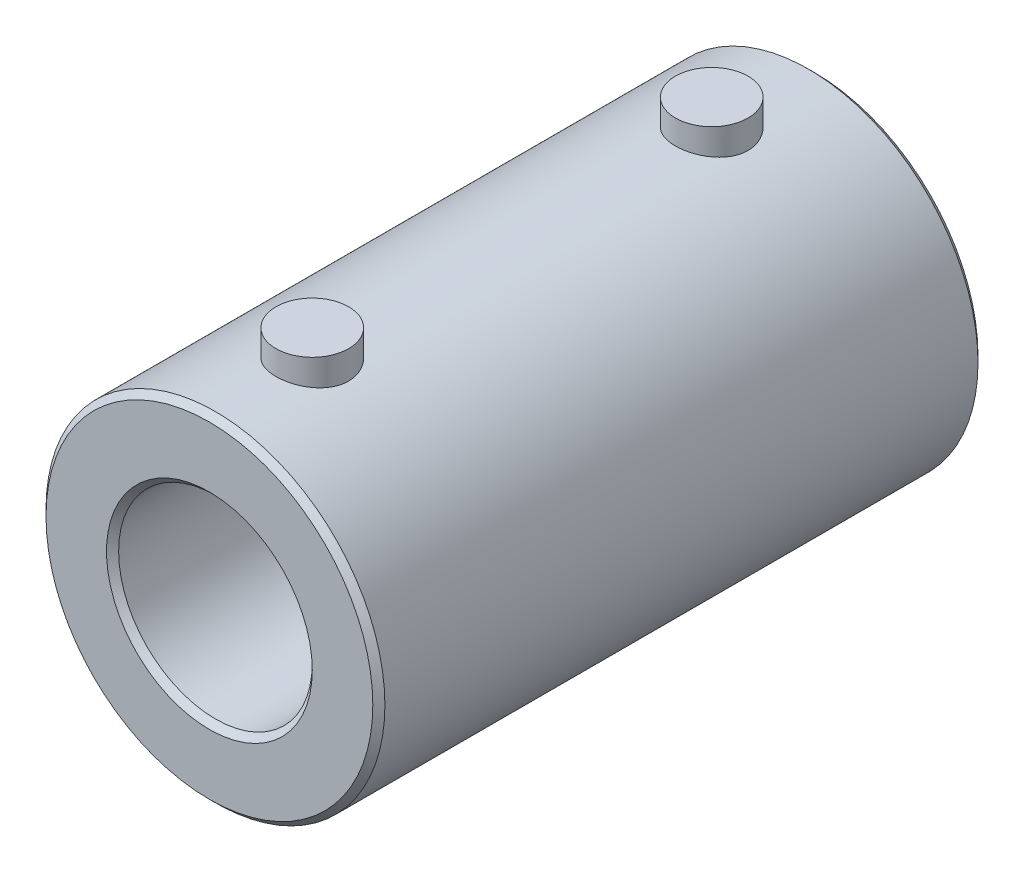
ISO-10303-21;
HEADER;
FILE_DESCRIPTION(('STEP AP214'),'2;1');
FILE_NAME('part.step','',(''),(''),'','','');
FILE_SCHEMA(('AUTOMOTIVE_DESIGN { 1 0 10303 214 1 1 1 1 }'));
ENDSEC;
DATA;
#1=APPLICATION_CONTEXT('core data for automotive mechanical design processes');
#2=APPLICATION_PROTOCOL_DEFINITION('international standard','automotive_design',2000,#1);
#3=PRODUCT_CONTEXT('',#1,'mechanical');
#4=PRODUCT('Part','Part','',(#3));
#5=PRODUCT_RELATED_PRODUCT_CATEGORY('part','',(#4));
#6=PRODUCT_DEFINITION_FORMATION('','',#4);
#7=PRODUCT_DEFINITION_CONTEXT('part definition',#1,'design');
#8=PRODUCT_DEFINITION('design','',#6,#7);
#9=PRODUCT_DEFINITION_SHAPE('','',#8);
#10=(LENGTH_UNIT() NAMED_UNIT(*) SI_UNIT(.MILLI.,.METRE.));
#11=(NAMED_UNIT(*) PLANE_ANGLE_UNIT() SI_UNIT($,.RADIAN.));
#12=(NAMED_UNIT(*) SI_UNIT($,.STERADIAN.) SOLID_ANGLE_UNIT());
#13=UNCERTAINTY_MEASURE_WITH_UNIT(LENGTH_MEASURE(1.E-05),#10,'distance_accuracy_value','');
#14=(GEOMETRIC_REPRESENTATION_CONTEXT(3) GLOBAL_UNCERTAINTY_ASSIGNED_CONTEXT((#13)) GLOBAL_UNIT_ASSIGNED_CONTEXT((#10,
#11,#12)) REPRESENTATION_CONTEXT('',''));
#15=CARTESIAN_POINT('',(0.,0.,0.));
#16=DIRECTION('',(0.,0.,1.));
#17=DIRECTION('',(1.,0.,0.));
#18=AXIS2_PLACEMENT_3D('',#15,#16,#17);
#19=CARTESIAN_POINT('',(0.,0.,25.));
#20=DIRECTION('',(0.,0.,-1.));
#21=DIRECTION('',(-1.,0.,0.));
#22=AXIS2_PLACEMENT_3D('',#19,#20,#21);
#23=CYLINDRICAL_SURFACE('',#22,7.);
#24=CARTESIAN_POINT('',(0.,0.,0.249999999999993));
#25=DIRECTION('',(0.,0.,1.));
#26=DIRECTION('',(1.,0.,0.));
#27=AXIS2_PLACEMENT_3D('',#24,#25,#26);
#28=CIRCLE('',#27,7.);
#29=CARTESIAN_POINT('',(7.,0.,0.249999999999993));
#30=VERTEX_POINT('',#29);
#31=EDGE_CURVE('E90',#30,#30,#28,.T.);
#32=ORIENTED_EDGE('',*,*,#31,.T.);
#33=EDGE_LOOP('',(#32));
#34=FACE_BOUND('',#33,.T.);
#35=CARTESIAN_POINT('',(0.,0.,24.75));
#36=DIRECTION('',(0.,0.,1.));
#37=DIRECTION('',(1.,0.,0.));
#38=AXIS2_PLACEMENT_3D('',#35,#36,#37);
#39=CIRCLE('',#38,7.);
#40=CARTESIAN_POINT('',(7.,0.,24.75));
#41=VERTEX_POINT('',#40);
#42=EDGE_CURVE('E94',#41,#41,#39,.F.);
#43=ORIENTED_EDGE('',*,*,#42,.T.);
#44=EDGE_LOOP('',(#43));
#45=FACE_BOUND('',#44,.T.);
#46=CARTESIAN_POINT('',(0.,7.,2.74999999999999));
#47=CARTESIAN_POINT('',(-0.0832358860906167,6.99999846043226,2.75000289957429));
#48=CARTESIAN_POINT('',(-0.166507195600275,6.9985002594971,2.75695160838785));
#49=CARTESIAN_POINT('',(-0.330687344293327,6.99266829827728,2.78453565685358));
#50=CARTESIAN_POINT('',(-0.41159440357119,6.98833245637099,2.80518104419493));
#51=CARTESIAN_POINT('',(-0.568649323817737,6.97730831788827,2.85948436460803));
#52=CARTESIAN_POINT('',(-0.644801963446556,6.97062242967171,2.89312897938131));
#53=CARTESIAN_POINT('',(-0.790378177960787,6.95562106817971,2.97243408617126));
#54=CARTESIAN_POINT('',(-0.859801981747369,6.94730565036661,3.01809416924993));
#55=CARTESIAN_POINT('',(-0.991024790535229,6.92981369246311,3.1208802996735));
#56=CARTESIAN_POINT('',(-1.05270503419445,6.92062683143259,3.17815622189852));
#57=CARTESIAN_POINT('',(-1.16566042389435,6.90250069814144,3.30222631568519));
#58=CARTESIAN_POINT('',(-1.21693467150908,6.8935614473163,3.36902130825125));
#59=CARTESIAN_POINT('',(-1.30814204379809,6.87684116047225,3.51110575286043));
#60=CARTESIAN_POINT('',(-1.34794958335009,6.8690733634436,3.5864775177562));
#61=CARTESIAN_POINT('',(-1.41428823691148,6.85572325558537,3.74303445376683));
#62=CARTESIAN_POINT('',(-1.44082087001716,6.85014069470711,3.82421895849257));
#63=CARTESIAN_POINT('',(-1.47946574422454,6.84189808926311,3.98881108658807));
#64=CARTESIAN_POINT('',(-1.49178779748342,6.83919556896486,4.07216727566386));
#65=CARTESIAN_POINT('',(-1.50231395206577,6.83689139845106,4.23980423250699));
#66=CARTESIAN_POINT('',(-1.50051971664629,6.83728938291729,4.32408489017994));
#67=CARTESIAN_POINT('',(-1.48303326340861,6.84110276603832,4.48962468793378));
#68=CARTESIAN_POINT('',(-1.46758398649408,6.84446541682162,4.57091088910015));
#69=CARTESIAN_POINT('',(-1.42361054298677,6.85374593375788,4.72971024028933));
#70=CARTESIAN_POINT('',(-1.39508566936466,6.85966393808402,4.80722318603231));
#71=CARTESIAN_POINT('',(-1.32554551075991,6.87344080755724,4.95696287287333));
#72=CARTESIAN_POINT('',(-1.2844361097283,6.88131420983365,5.02914451271254));
#73=CARTESIAN_POINT('',(-1.19096007283993,6.89810572501288,5.16567516495795));
#74=CARTESIAN_POINT('',(-1.13859196103562,6.90702397481896,5.23002314868619));
#75=CARTESIAN_POINT('',(-1.0227954275532,6.92512718393878,5.35045935567339));
#76=CARTESIAN_POINT('',(-0.959160233964409,6.93431383972178,5.40634870658473));
#77=CARTESIAN_POINT('',(-0.823317306269096,6.95175017497059,5.50669373368965));
#78=CARTESIAN_POINT('',(-0.751109428775399,6.95999983875972,5.55114921860038));
#79=CARTESIAN_POINT('',(-0.599933462049959,6.97465778534003,5.62741067990692));
#80=CARTESIAN_POINT('',(-0.520952258863482,6.98106238643354,5.65919141257797));
#81=CARTESIAN_POINT('',(-0.358603146685705,6.99128109245334,5.70897564832108));
#82=CARTESIAN_POINT('',(-0.275235851133668,6.99509555860384,5.72698107256331));
#83=CARTESIAN_POINT('',(-0.108187670836628,6.99965306347808,5.74841621414342));
#84=CARTESIAN_POINT('',(-0.0245431772716138,7.00045336521066,5.75211771288177));
#85=CARTESIAN_POINT('',(0.142168973650405,6.99905248935969,5.74557542887483));
#86=CARTESIAN_POINT('',(0.225236668127256,6.99685150675698,5.73533255203705));
#87=CARTESIAN_POINT('',(0.387542537982806,6.98973143045266,5.70141775633829));
#88=CARTESIAN_POINT('',(0.466811712908478,6.9848410504546,5.67788763052746));
#89=CARTESIAN_POINT('',(0.620278450473418,6.9728892442151,5.61822305700517));
#90=CARTESIAN_POINT('',(0.69447559258774,6.96582763822237,5.58208756568834));
#91=CARTESIAN_POINT('',(0.836821397964754,6.950175043904,5.49766645693967));
#92=CARTESIAN_POINT('',(0.904872575111141,6.94156431354275,5.44922020509026));
#93=CARTESIAN_POINT('',(1.0319769255236,6.92381033034847,5.34176517511125));
#94=CARTESIAN_POINT('',(1.091028978692,6.91466701142097,5.28275508411255));
#95=CARTESIAN_POINT('',(1.19952711057989,6.89668172706324,5.15460262981285));
#96=CARTESIAN_POINT('',(1.24878537255157,6.88784792221285,5.08529990077789));
#97=CARTESIAN_POINT('',(1.3349641538604,6.87166654559681,4.939245403522));
#98=CARTESIAN_POINT('',(1.37188519913706,6.86431891048055,4.8624939530225));
#99=CARTESIAN_POINT('',(1.43209741248548,6.8520100980739,4.70412770100539));
#100=CARTESIAN_POINT('',(1.45546398641275,6.84703574582967,4.62254264356932));
#101=CARTESIAN_POINT('',(1.48812696085335,6.84001186708418,4.45648441616635));
#102=CARTESIAN_POINT('',(1.49742550780258,6.83796189439706,4.37201168879867));
#103=CARTESIAN_POINT('',(1.5015999992604,6.83704618848155,4.20446765682475));
#104=CARTESIAN_POINT('',(1.49677347258311,6.83811476518543,4.12140398501941));
#105=CARTESIAN_POINT('',(1.47349789406331,6.8431676318483,3.9573027578674));
#106=CARTESIAN_POINT('',(1.45504898957979,6.84715189026714,3.87626518061342));
#107=CARTESIAN_POINT('',(1.40519345940434,6.85755581104157,3.71874134213082));
#108=CARTESIAN_POINT('',(1.37382847170887,6.86396764224703,3.6422413513357));
#109=CARTESIAN_POINT('',(1.29906751595601,6.87850764590649,3.49554462749314));
#110=CARTESIAN_POINT('',(1.255670353015,6.88663598880363,3.42534852138495));
#111=CARTESIAN_POINT('',(1.15708290349304,6.90389055593232,3.29178180627463));
#112=CARTESIAN_POINT('',(1.10167987421236,6.91303309938926,3.22857030405301));
#113=CARTESIAN_POINT('',(0.981086554619619,6.93117449799694,3.11224373747953));
#114=CARTESIAN_POINT('',(0.915894009385596,6.94017331951296,3.05913100568779));
#115=CARTESIAN_POINT('',(0.776603147268716,6.95714491048987,2.96388404049443));
#116=CARTESIAN_POINT('',(0.702404846009641,6.96510364570626,2.92189339376901));
#117=CARTESIAN_POINT('',(0.547850160940598,6.97895826104019,2.85104547109381));
#118=CARTESIAN_POINT('',(0.467499105863879,6.98485590212343,2.82217697741496));
#119=CARTESIAN_POINT('',(0.322535217553203,6.99284848461772,2.78364781486884));
#120=CARTESIAN_POINT('',(0.258717205545978,6.99551391888263,2.77105356601996));
#121=CARTESIAN_POINT('',(0.129939960853846,6.99909024154719,2.75422869828832));
#122=CARTESIAN_POINT('',(0.0649807750887446,7.00000120191314,2.74999773635393));
#123=CARTESIAN_POINT('',(0.,7.,2.74999999999999));
#124=B_SPLINE_CURVE_WITH_KNOTS('',3,(#46,#47,#48,#49,#50,#51,#52,#53,#54,#55,#56,#57,#58,#59,
#60,#61,#62,#63,#64,#65,#66,#67,#68,#69,#70,#71,#72,#73,#74,#75,#76,#77,#78,#79,#80,#81,#82,#83,
#84,#85,#86,#87,#88,#89,#90,#91,#92,#93,#94,#95,#96,#97,#98,#99,#100,#101,#102,#103,#104,#105,
#106,#107,#108,#109,#110,#111,#112,#113,#114,#115,#116,#117,#118,#119,#120,#121,#122,#123),
.UNSPECIFIED.,.T.,.F.,(4,2,2,2,2,2,2,2,2,2,2,2,2,2,2,2,2,2,2,2,2,2,2,2,2,2,2,2,2,2,2,2,2,2,2,2,
2,2,4),(0.,0.249469836512082,0.499122883219936,0.748520824425602,0.997910278645886,
1.25074961881732,1.50361077918506,1.7591442921451,2.0146485567749,2.26633008124666,
2.51798195169165,2.76524475452927,3.01252092904568,3.26169356165968,3.51089887920889,
3.76527011050291,4.0196455970235,4.27452521139806,4.52936927256343,4.77934665704185,
5.02930780231429,5.27665060589267,5.52401389198434,5.77478733867803,6.02559197304485,
6.28082063283534,6.53603841075805,6.78982240408475,7.04356767229185,7.29200680540294,
7.5404432510827,7.78808499706785,8.03575134451623,8.28822950154114,8.54076590397115,
8.79641910357222,9.05185334010271,9.24661799132294,9.44137465337336),.UNSPECIFIED.);
#125=CARTESIAN_POINT('',(0.,7.,2.74999999999999));
#126=VERTEX_POINT('',#125);
#127=EDGE_CURVE('E42',#126,#126,#124,.T.);
#128=ORIENTED_EDGE('',*,*,#127,.F.);
#129=EDGE_LOOP('',(#128));
#130=FACE_BOUND('',#129,.T.);
#131=CARTESIAN_POINT('',(0.,7.,19.25));
#132=CARTESIAN_POINT('',(-0.0832358860906166,6.99999846043226,19.2500028995743));
#133=CARTESIAN_POINT('',(-0.166507195600274,6.9985002594971,19.2569516083879));
#134=CARTESIAN_POINT('',(-0.330687344293327,6.99266829827728,19.2845356568536));
#135=CARTESIAN_POINT('',(-0.41159440357119,6.98833245637099,19.3051810441949));
#136=CARTESIAN_POINT('',(-0.568649323817736,6.97730831788827,19.359484364608));
#137=CARTESIAN_POINT('',(-0.644801963446554,6.97062242967171,19.3931289793813));
#138=CARTESIAN_POINT('',(-0.790378177960786,6.95562106817971,19.4724340861713));
#139=CARTESIAN_POINT('',(-0.859801981747369,6.94730565036661,19.5180941692499));
#140=CARTESIAN_POINT('',(-0.991024790535229,6.92981369246311,19.6208802996735));
#141=CARTESIAN_POINT('',(-1.05270503419445,6.92062683143259,19.6781562218985));
#142=CARTESIAN_POINT('',(-1.16566042389435,6.90250069814144,19.8022263156852));
#143=CARTESIAN_POINT('',(-1.21693467150908,6.8935614473163,19.8690213082513));
#144=CARTESIAN_POINT('',(-1.30814204379809,6.87684116047225,20.0111057528604));
#145=CARTESIAN_POINT('',(-1.34794958335009,6.8690733634436,20.0864775177562));
#146=CARTESIAN_POINT('',(-1.41428823691148,6.85572325558537,20.2430344537668));
#147=CARTESIAN_POINT('',(-1.44082087001716,6.85014069470711,20.3242189584926));
#148=CARTESIAN_POINT('',(-1.47946574422454,6.84189808926311,20.4888110865881));
#149=CARTESIAN_POINT('',(-1.49178779748342,6.83919556896486,20.5721672756639));
#150=CARTESIAN_POINT('',(-1.50231395206577,6.83689139845106,20.739804232507));
#151=CARTESIAN_POINT('',(-1.50051971664629,6.83728938291729,20.8240848901799));
#152=CARTESIAN_POINT('',(-1.48303326340861,6.84110276603832,20.9896246879338));
#153=CARTESIAN_POINT('',(-1.46758398649408,6.84446541682162,21.0709108891001));
#154=CARTESIAN_POINT('',(-1.42361054298677,6.85374593375788,21.2297102402893));
#155=CARTESIAN_POINT('',(-1.39508566936466,6.85966393808402,21.3072231860323));
#156=CARTESIAN_POINT('',(-1.32554551075991,6.87344080755724,21.4569628728733));
#157=CARTESIAN_POINT('',(-1.2844361097283,6.88131420983365,21.5291445127126));
#158=CARTESIAN_POINT('',(-1.19096007283993,6.89810572501288,21.665675164958));
#159=CARTESIAN_POINT('',(-1.13859196103562,6.90702397481896,21.7300231486862));
#160=CARTESIAN_POINT('',(-1.0227954275532,6.92512718393878,21.8504593556734));
#161=CARTESIAN_POINT('',(-0.959160233964412,6.93431383972178,21.9063487065847));
#162=CARTESIAN_POINT('',(-0.823317306269098,6.95175017497059,22.0066937336897));
#163=CARTESIAN_POINT('',(-0.7511094287754,6.95999983875972,22.0511492186004));
#164=CARTESIAN_POINT('',(-0.599933462049959,6.97465778534003,22.1274106799069));
#165=CARTESIAN_POINT('',(-0.520952258863482,6.98106238643354,22.159191412578));
#166=CARTESIAN_POINT('',(-0.358603146685706,6.99128109245334,22.2089756483211));
#167=CARTESIAN_POINT('',(-0.275235851133668,6.99509555860384,22.2269810725633));
#168=CARTESIAN_POINT('',(-0.108187670836629,6.99965306347808,22.2484162141434));
#169=CARTESIAN_POINT('',(-0.0245431772716145,7.00045336521066,22.2521177128818));
#170=CARTESIAN_POINT('',(0.142168973650404,6.99905248935969,22.2455754288748));
#171=CARTESIAN_POINT('',(0.225236668127254,6.99685150675698,22.2353325520371));
#172=CARTESIAN_POINT('',(0.387542537982805,6.98973143045266,22.2014177563383));
#173=CARTESIAN_POINT('',(0.466811712908478,6.9848410504546,22.1778876305275));
#174=CARTESIAN_POINT('',(0.620278450473418,6.9728892442151,22.1182230570052));
#175=CARTESIAN_POINT('',(0.694475592587739,6.96582763822237,22.0820875656883));
#176=CARTESIAN_POINT('',(0.836821397964753,6.950175043904,21.9976664569397));
#177=CARTESIAN_POINT('',(0.90487257511114,6.94156431354275,21.9492202050903));
#178=CARTESIAN_POINT('',(1.0319769255236,6.92381033034847,21.8417651751113));
#179=CARTESIAN_POINT('',(1.091028978692,6.91466701142097,21.7827550841126));
#180=CARTESIAN_POINT('',(1.19952711057989,6.89668172706324,21.6546026298129));
#181=CARTESIAN_POINT('',(1.24878537255156,6.88784792221285,21.5852999007779));
#182=CARTESIAN_POINT('',(1.3349641538604,6.87166654559681,21.439245403522));
#183=CARTESIAN_POINT('',(1.37188519913705,6.86431891048055,21.3624939530225));
#184=CARTESIAN_POINT('',(1.43209741248548,6.8520100980739,21.2041277010054));
#185=CARTESIAN_POINT('',(1.45546398641275,6.84703574582967,21.1225426435693));
#186=CARTESIAN_POINT('',(1.48812696085335,6.84001186708418,20.9564844161664));
#187=CARTESIAN_POINT('',(1.49742550780258,6.83796189439706,20.8720116887987));
#188=CARTESIAN_POINT('',(1.5015999992604,6.83704618848155,20.7044676568248));
#189=CARTESIAN_POINT('',(1.49677347258311,6.83811476518543,20.6214039850194));
#190=CARTESIAN_POINT('',(1.47349789406331,6.8431676318483,20.4573027578674));
#191=CARTESIAN_POINT('',(1.45504898957979,6.84715189026714,20.3762651806134));
#192=CARTESIAN_POINT('',(1.40519345940434,6.85755581104157,20.2187413421308));
#193=CARTESIAN_POINT('',(1.37382847170887,6.86396764224703,20.1422413513357));
#194=CARTESIAN_POINT('',(1.29906751595601,6.87850764590649,19.9955446274931));
#195=CARTESIAN_POINT('',(1.255670353015,6.88663598880363,19.925348521385));
#196=CARTESIAN_POINT('',(1.15708290349304,6.90389055593232,19.7917818062746));
#197=CARTESIAN_POINT('',(1.10167987421237,6.91303309938926,19.728570304053));
#198=CARTESIAN_POINT('',(0.98108655461962,6.93117449799694,19.6122437374795));
#199=CARTESIAN_POINT('',(0.915894009385597,6.94017331951296,19.5591310056878));
#200=CARTESIAN_POINT('',(0.776603147268718,6.95714491048987,19.4638840404944));
#201=CARTESIAN_POINT('',(0.702404846009642,6.96510364570626,19.421893393769));
#202=CARTESIAN_POINT('',(0.547850160940599,6.97895826104019,19.3510454710938));
#203=CARTESIAN_POINT('',(0.467499105863881,6.98485590212343,19.322176977415));
#204=CARTESIAN_POINT('',(0.322535217553204,6.99284848461772,19.2836478148688));
#205=CARTESIAN_POINT('',(0.258717205545979,6.99551391888263,19.27105356602));
#206=CARTESIAN_POINT('',(0.129939960853846,6.99909024154719,19.2542286982883));
#207=CARTESIAN_POINT('',(0.064980775088745,7.00000120191314,19.2499977363539));
#208=CARTESIAN_POINT('',(0.,7.,19.25));
#209=B_SPLINE_CURVE_WITH_KNOTS('',3,(#131,#132,#133,#134,#135,#136,#137,#138,#139,#140,#141,
#142,#143,#144,#145,#146,#147,#148,#149,#150,#151,#152,#153,#154,#155,#156,#157,#158,#159,#160,
#161,#162,#163,#164,#165,#166,#167,#168,#169,#170,#171,#172,#173,#174,#175,#176,#177,#178,#179,
#180,#181,#182,#183,#184,#185,#186,#187,#188,#189,#190,#191,#192,#193,#194,#195,#196,#197,#198,
#199,#200,#201,#202,#203,#204,#205,#206,#207,#208),.UNSPECIFIED.,.T.,.F.,(4,2,2,2,2,2,2,2,2,2,2,
2,2,2,2,2,2,2,2,2,2,2,2,2,2,2,2,2,2,2,2,2,2,2,2,2,2,2,4),(0.,0.249469836512082,
0.499122883219935,0.748520824425601,0.997910278645884,1.25074961881732,1.50361077918506,
1.75914429214511,2.01464855677489,2.26633008124665,2.51798195169165,2.76524475452928,
3.01252092904568,3.26169356165968,3.51089887920889,3.76527011050291,4.0196455970235,
4.27452521139806,4.52936927256344,4.77934665704185,5.02930780231429,5.27665060589267,
5.52401389198434,5.77478733867803,6.02559197304485,6.28082063283534,6.53603841075805,
6.78982240408475,7.04356767229185,7.29200680540294,7.5404432510827,7.78808499706786,
8.03575134451624,8.28822950154114,8.54076590397115,8.79641910357222,9.05185334010271,
9.24661799132294,9.44137465337336),.UNSPECIFIED.);
#210=CARTESIAN_POINT('',(0.,7.,19.25));
#211=VERTEX_POINT('',#210);
#212=EDGE_CURVE('E10',#211,#211,#209,.T.);
#213=ORIENTED_EDGE('',*,*,#212,.F.);
#214=EDGE_LOOP('',(#213));
#215=FACE_BOUND('',#214,.T.);
#216=ADVANCED_FACE('F31',(#34,#45,#130,#215),#23,.T.);
#217=CARTESIAN_POINT('',(0.,0.,25.));
#218=DIRECTION('',(0.,0.,1.));
#219=DIRECTION('',(1.,0.,0.));
#220=AXIS2_PLACEMENT_3D('',#217,#218,#219);
#221=PLANE('',#220);
#222=CARTESIAN_POINT('',(0.,0.,25.));
#223=DIRECTION('',(0.,0.,1.));
#224=DIRECTION('',(1.,0.,0.));
#225=AXIS2_PLACEMENT_3D('',#222,#223,#224);
#226=CIRCLE('',#225,4.25);
#227=CARTESIAN_POINT('',(4.25,0.,25.));
#228=VERTEX_POINT('',#227);
#229=EDGE_CURVE('E46',#228,#228,#226,.F.);
#230=ORIENTED_EDGE('',*,*,#229,.T.);
#231=EDGE_LOOP('',(#230));
#232=FACE_BOUND('',#231,.T.);
#233=CARTESIAN_POINT('',(0.,0.,25.));
#234=DIRECTION('',(0.,0.,1.));
#235=DIRECTION('',(1.,0.,0.));
#236=AXIS2_PLACEMENT_3D('',#233,#234,#235);
#237=CIRCLE('',#236,6.74999999999999);
#238=CARTESIAN_POINT('',(6.74999999999999,0.,25.));
#239=VERTEX_POINT('',#238);
#240=EDGE_CURVE('E50',#239,#239,#237,.T.);
#241=ORIENTED_EDGE('',*,*,#240,.T.);
#242=EDGE_LOOP('',(#241));
#243=FACE_BOUND('',#242,.T.);
#244=ADVANCED_FACE('F72',(#232,#243),#221,.T.);
#245=CARTESIAN_POINT('',(0.,0.,0.));
#246=DIRECTION('',(0.,0.,1.));
#247=DIRECTION('',(1.,0.,0.));
#248=AXIS2_PLACEMENT_3D('',#245,#246,#247);
#249=PLANE('',#248);
#250=CARTESIAN_POINT('',(0.,0.,0.));
#251=DIRECTION('',(0.,0.,1.));
#252=DIRECTION('',(1.,0.,0.));
#253=AXIS2_PLACEMENT_3D('',#250,#251,#252);
#254=CIRCLE('',#253,4.25);
#255=CARTESIAN_POINT('',(4.25,0.,0.));
#256=VERTEX_POINT('',#255);
#257=EDGE_CURVE('E128',#256,#256,#254,.T.);
#258=ORIENTED_EDGE('',*,*,#257,.T.);
#259=EDGE_LOOP('',(#258));
#260=FACE_BOUND('',#259,.T.);
#261=CARTESIAN_POINT('',(0.,0.,0.));
#262=DIRECTION('',(0.,0.,1.));
#263=DIRECTION('',(1.,0.,0.));
#264=AXIS2_PLACEMENT_3D('',#261,#262,#263);
#265=CIRCLE('',#264,6.75);
#266=CARTESIAN_POINT('',(6.75,0.,0.));
#267=VERTEX_POINT('',#266);
#268=EDGE_CURVE('E129',#267,#267,#265,.F.);
#269=ORIENTED_EDGE('',*,*,#268,.T.);
#270=EDGE_LOOP('',(#269));
#271=FACE_BOUND('',#270,.T.);
#272=ADVANCED_FACE('F70',(#260,#271),#249,.F.);
#273=CARTESIAN_POINT('',(0.,0.,25.));
#274=DIRECTION('',(0.,0.,-1.));
#275=DIRECTION('',(-1.,0.,0.));
#276=AXIS2_PLACEMENT_3D('',#273,#274,#275);
#277=CYLINDRICAL_SURFACE('',#276,4.);
#278=CARTESIAN_POINT('',(0.,0.,0.25));
#279=DIRECTION('',(0.,0.,1.));
#280=DIRECTION('',(1.,0.,0.));
#281=AXIS2_PLACEMENT_3D('',#278,#279,#280);
#282=CIRCLE('',#281,4.);
#283=CARTESIAN_POINT('',(4.,0.,0.25));
#284=VERTEX_POINT('',#283);
#285=EDGE_CURVE('E97',#284,#284,#282,.F.);
#286=ORIENTED_EDGE('',*,*,#285,.T.);
#287=EDGE_LOOP('',(#286));
#288=FACE_BOUND('',#287,.T.);
#289=CARTESIAN_POINT('',(0.,0.,24.75));
#290=DIRECTION('',(0.,0.,1.));
#291=DIRECTION('',(1.,0.,0.));
#292=AXIS2_PLACEMENT_3D('',#289,#290,#291);
#293=CIRCLE('',#292,4.);
#294=CARTESIAN_POINT('',(4.,0.,24.75));
#295=VERTEX_POINT('',#294);
#296=EDGE_CURVE('E101',#295,#295,#293,.T.);
#297=ORIENTED_EDGE('',*,*,#296,.T.);
#298=EDGE_LOOP('',(#297));
#299=FACE_BOUND('',#298,.T.);
#300=ADVANCED_FACE('F66',(#288,#299),#277,.F.);
#301=CARTESIAN_POINT('',(0.,0.,0.));
#302=DIRECTION('',(0.,0.,-1.));
#303=DIRECTION('',(-1.,0.,0.));
#304=AXIS2_PLACEMENT_3D('',#301,#302,#303);
#305=CONICAL_SURFACE('',#304,4.25,0.785398163397448);
#306=ORIENTED_EDGE('',*,*,#285,.F.);
#307=EDGE_LOOP('',(#306));
#308=FACE_BOUND('',#307,.T.);
#309=ORIENTED_EDGE('',*,*,#257,.F.);
#310=EDGE_LOOP('',(#309));
#311=FACE_BOUND('',#310,.T.);
#312=ADVANCED_FACE('F69',(#308,#311),#305,.F.);
#313=CARTESIAN_POINT('',(0.,0.,0.249999999999993));
#314=DIRECTION('',(0.,0.,1.));
#315=DIRECTION('',(1.,0.,0.));
#316=AXIS2_PLACEMENT_3D('',#313,#314,#315);
#317=CONICAL_SURFACE('',#316,7.,0.785398163397457);
#318=ORIENTED_EDGE('',*,*,#268,.F.);
#319=EDGE_LOOP('',(#318));
#320=FACE_BOUND('',#319,.T.);
#321=ORIENTED_EDGE('',*,*,#31,.F.);
#322=EDGE_LOOP('',(#321));
#323=FACE_BOUND('',#322,.T.);
#324=ADVANCED_FACE('F112',(#320,#323),#317,.T.);
#325=CARTESIAN_POINT('',(0.,0.,24.75));
#326=DIRECTION('',(0.,0.,1.));
#327=DIRECTION('',(1.,0.,0.));
#328=AXIS2_PLACEMENT_3D('',#325,#326,#327);
#329=CONICAL_SURFACE('',#328,4.,0.785398163397441);
#330=ORIENTED_EDGE('',*,*,#229,.F.);
#331=EDGE_LOOP('',(#330));
#332=FACE_BOUND('',#331,.T.);
#333=ORIENTED_EDGE('',*,*,#296,.F.);
#334=EDGE_LOOP('',(#333));
#335=FACE_BOUND('',#334,.T.);
#336=ADVANCED_FACE('F109',(#332,#335),#329,.F.);
#337=CARTESIAN_POINT('',(0.,0.,25.));
#338=DIRECTION('',(0.,0.,-1.));
#339=DIRECTION('',(-1.,0.,0.));
#340=AXIS2_PLACEMENT_3D('',#337,#338,#339);
#341=CONICAL_SURFACE('',#340,6.74999999999999,0.785398163397457);
#342=ORIENTED_EDGE('',*,*,#42,.F.);
#343=EDGE_LOOP('',(#342));
#344=FACE_BOUND('',#343,.T.);
#345=ORIENTED_EDGE('',*,*,#240,.F.);
#346=EDGE_LOOP('',(#345));
#347=FACE_BOUND('',#346,.T.);
#348=ADVANCED_FACE('F33',(#344,#347),#341,.T.);
#349=CARTESIAN_POINT('',(0.,7.99999999999999,4.24999999999999));
#350=DIRECTION('',(0.,-1.,0.));
#351=DIRECTION('',(0.,0.,-1.));
#352=AXIS2_PLACEMENT_3D('',#349,#350,#351);
#353=CYLINDRICAL_SURFACE('',#352,1.5);
#354=CARTESIAN_POINT('',(0.,7.99999999999999,4.24999999999999));
#355=DIRECTION('',(0.,1.,0.));
#356=DIRECTION('',(0.,0.,1.));
#357=AXIS2_PLACEMENT_3D('',#354,#355,#356);
#358=CIRCLE('',#357,1.5);
#359=CARTESIAN_POINT('',(0.,7.99999999999999,5.74999999999999));
#360=VERTEX_POINT('',#359);
#361=EDGE_CURVE('E133',#360,#360,#358,.T.);
#362=ORIENTED_EDGE('',*,*,#361,.F.);
#363=EDGE_LOOP('',(#362));
#364=FACE_BOUND('',#363,.T.);
#365=ORIENTED_EDGE('',*,*,#127,.T.);
#366=EDGE_LOOP('',(#365));
#367=FACE_BOUND('',#366,.T.);
#368=ADVANCED_FACE('F59',(#364,#367),#353,.T.);
#369=CARTESIAN_POINT('',(0.,7.99999999999999,4.24999999999999));
#370=DIRECTION('',(0.,1.,0.));
#371=DIRECTION('',(0.,0.,1.));
#372=AXIS2_PLACEMENT_3D('',#369,#370,#371);
#373=PLANE('',#372);
#374=ORIENTED_EDGE('',*,*,#361,.T.);
#375=EDGE_LOOP('',(#374));
#376=FACE_BOUND('',#375,.T.);
#377=ADVANCED_FACE('F64',(#376),#373,.T.);
#378=CARTESIAN_POINT('',(0.,7.99999999999999,20.75));
#379=DIRECTION('',(0.,-1.,0.));
#380=DIRECTION('',(0.,0.,-1.));
#381=AXIS2_PLACEMENT_3D('',#378,#379,#380);
#382=CYLINDRICAL_SURFACE('',#381,1.5);
#383=CARTESIAN_POINT('',(0.,7.99999999999999,20.75));
#384=DIRECTION('',(0.,1.,0.));
#385=DIRECTION('',(0.,0.,-1.));
#386=AXIS2_PLACEMENT_3D('',#383,#384,#385);
#387=CIRCLE('',#386,1.5);
#388=CARTESIAN_POINT('',(0.,7.99999999999999,19.25));
#389=VERTEX_POINT('',#388);
#390=EDGE_CURVE('E138',#389,#389,#387,.T.);
#391=ORIENTED_EDGE('',*,*,#390,.F.);
#392=EDGE_LOOP('',(#391));
#393=FACE_BOUND('',#392,.T.);
#394=ORIENTED_EDGE('',*,*,#212,.T.);
#395=EDGE_LOOP('',(#394));
#396=FACE_BOUND('',#395,.T.);
#397=ADVANCED_FACE('F144',(#393,#396),#382,.T.);
#398=CARTESIAN_POINT('',(0.,7.99999999999999,20.75));
#399=DIRECTION('',(0.,-1.,0.));
#400=DIRECTION('',(0.,0.,-1.));
#401=AXIS2_PLACEMENT_3D('',#398,#399,#400);
#402=PLANE('',#401);
#403=ORIENTED_EDGE('',*,*,#390,.T.);
#404=EDGE_LOOP('',(#403));
#405=FACE_BOUND('',#404,.T.);
#406=ADVANCED_FACE('F142',(#405),#402,.F.);
#407=CLOSED_SHELL('',(#216,#244,#272,#300,#312,#324,#336,#348,#368,#377,#397,#406));
#408=MANIFOLD_SOLID_BREP('B2',#407);
#409=ADVANCED_BREP_SHAPE_REPRESENTATION('',(#18,#408),#14);
#410=SHAPE_DEFINITION_REPRESENTATION(#9,#409);
ENDSEC;
END-ISO-10303-21;
